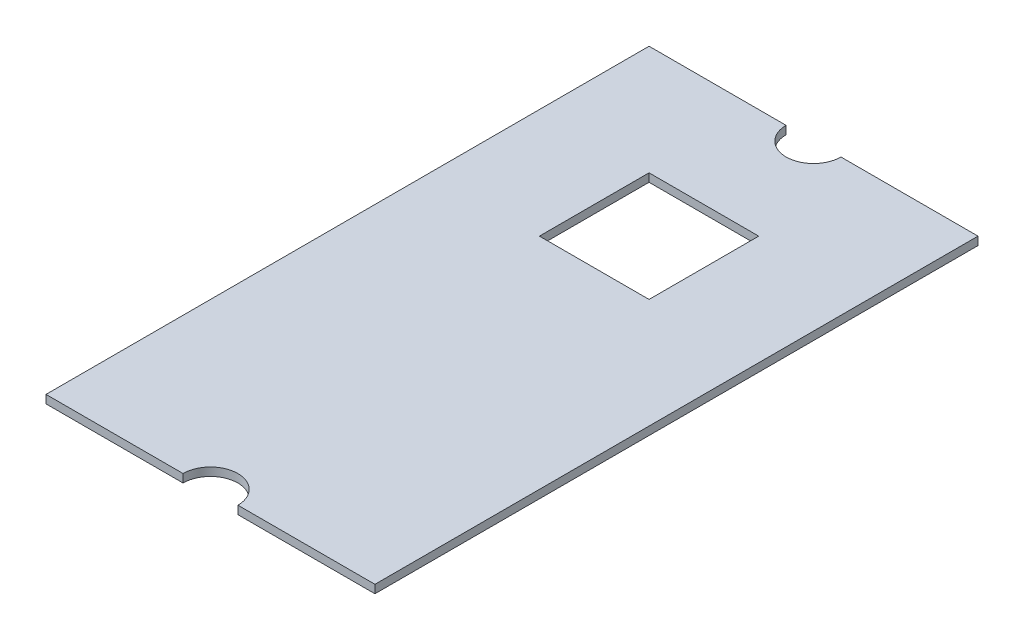
ISO-10303-21;
HEADER;
FILE_DESCRIPTION(('STEP AP214'),'2;1');
FILE_NAME('part.step','',(''),(''),'','','');
FILE_SCHEMA(('AUTOMOTIVE_DESIGN { 1 0 10303 214 1 1 1 1 }'));
ENDSEC;
DATA;
#1=APPLICATION_CONTEXT('core data for automotive mechanical design processes');
#2=APPLICATION_PROTOCOL_DEFINITION('international standard','automotive_design',2000,#1);
#3=PRODUCT_CONTEXT('',#1,'mechanical');
#4=PRODUCT('Part','Part','',(#3));
#5=PRODUCT_RELATED_PRODUCT_CATEGORY('part','',(#4));
#6=PRODUCT_DEFINITION_FORMATION('','',#4);
#7=PRODUCT_DEFINITION_CONTEXT('part definition',#1,'design');
#8=PRODUCT_DEFINITION('design','',#6,#7);
#9=PRODUCT_DEFINITION_SHAPE('','',#8);
#10=(LENGTH_UNIT() NAMED_UNIT(*) SI_UNIT(.MILLI.,.METRE.));
#11=(NAMED_UNIT(*) PLANE_ANGLE_UNIT() SI_UNIT($,.RADIAN.));
#12=(NAMED_UNIT(*) SI_UNIT($,.STERADIAN.) SOLID_ANGLE_UNIT());
#13=UNCERTAINTY_MEASURE_WITH_UNIT(LENGTH_MEASURE(1.E-05),#10,'distance_accuracy_value','');
#14=(GEOMETRIC_REPRESENTATION_CONTEXT(3) GLOBAL_UNCERTAINTY_ASSIGNED_CONTEXT((#13)) GLOBAL_UNIT_ASSIGNED_CONTEXT((#10,
#11,#12)) REPRESENTATION_CONTEXT('',''));
#15=CARTESIAN_POINT('',(0.,0.,0.));
#16=DIRECTION('',(0.,0.,1.));
#17=DIRECTION('',(1.,0.,0.));
#18=AXIS2_PLACEMENT_3D('',#15,#16,#17);
#19=CARTESIAN_POINT('',(0.,0.,220.));
#20=DIRECTION('',(0.,0.,-1.));
#21=DIRECTION('',(-1.,0.,0.));
#22=AXIS2_PLACEMENT_3D('',#19,#20,#21);
#23=PLANE('',#22);
#24=DIRECTION('',(1.,0.,0.));
#25=VECTOR('',#24,1.);
#26=CARTESIAN_POINT('',(0.,0.,220.));
#27=LINE('',#26,#25);
#28=CARTESIAN_POINT('',(0.,0.,220.));
#29=VERTEX_POINT('',#28);
#30=CARTESIAN_POINT('',(50.,0.,220.));
#31=VERTEX_POINT('',#30);
#32=EDGE_CURVE('E182',#29,#31,#27,.T.);
#33=ORIENTED_EDGE('',*,*,#32,.T.);
#34=DIRECTION('',(0.,1.,0.));
#35=VECTOR('',#34,1.);
#36=CARTESIAN_POINT('',(50.,-7.,220.));
#37=LINE('',#36,#35);
#38=CARTESIAN_POINT('',(50.,3.,220.));
#39=VERTEX_POINT('',#38);
#40=EDGE_CURVE('E11',#31,#39,#37,.T.);
#41=ORIENTED_EDGE('',*,*,#40,.T.);
#42=DIRECTION('',(-1.,0.,0.));
#43=VECTOR('',#42,1.);
#44=CARTESIAN_POINT('',(0.,3.,220.));
#45=LINE('',#44,#43);
#46=CARTESIAN_POINT('',(0.,3.,220.));
#47=VERTEX_POINT('',#46);
#48=EDGE_CURVE('E187',#39,#47,#45,.T.);
#49=ORIENTED_EDGE('',*,*,#48,.T.);
#50=DIRECTION('',(0.,-1.,0.));
#51=VECTOR('',#50,1.);
#52=CARTESIAN_POINT('',(0.,0.,220.));
#53=LINE('',#52,#51);
#54=EDGE_CURVE('E177',#47,#29,#53,.T.);
#55=ORIENTED_EDGE('',*,*,#54,.T.);
#56=EDGE_LOOP('',(#33,#41,#49,#55));
#57=FACE_BOUND('',#56,.T.);
#58=ADVANCED_FACE('F40',(#57),#23,.F.);
#59=CARTESIAN_POINT('',(0.,0.,0.));
#60=DIRECTION('',(0.,0.,-1.));
#61=DIRECTION('',(-1.,0.,0.));
#62=AXIS2_PLACEMENT_3D('',#59,#60,#61);
#63=PLANE('',#62);
#64=DIRECTION('',(0.,1.,0.));
#65=VECTOR('',#64,1.);
#66=CARTESIAN_POINT('',(50.,-7.,0.));
#67=LINE('',#66,#65);
#68=CARTESIAN_POINT('',(50.,0.,0.));
#69=VERTEX_POINT('',#68);
#70=CARTESIAN_POINT('',(50.,3.,0.));
#71=VERTEX_POINT('',#70);
#72=EDGE_CURVE('E216',#69,#71,#67,.T.);
#73=ORIENTED_EDGE('',*,*,#72,.F.);
#74=DIRECTION('',(1.,0.,0.));
#75=VECTOR('',#74,1.);
#76=CARTESIAN_POINT('',(0.,0.,0.));
#77=LINE('',#76,#75);
#78=CARTESIAN_POINT('',(0.,0.,0.));
#79=VERTEX_POINT('',#78);
#80=EDGE_CURVE('E195',#79,#69,#77,.T.);
#81=ORIENTED_EDGE('',*,*,#80,.F.);
#82=DIRECTION('',(0.,-1.,0.));
#83=VECTOR('',#82,1.);
#84=CARTESIAN_POINT('',(0.,0.,0.));
#85=LINE('',#84,#83);
#86=CARTESIAN_POINT('',(0.,3.,0.));
#87=VERTEX_POINT('',#86);
#88=EDGE_CURVE('E176',#87,#79,#85,.T.);
#89=ORIENTED_EDGE('',*,*,#88,.F.);
#90=DIRECTION('',(-1.,0.,0.));
#91=VECTOR('',#90,1.);
#92=CARTESIAN_POINT('',(0.,3.,0.));
#93=LINE('',#92,#91);
#94=EDGE_CURVE('E200',#71,#87,#93,.T.);
#95=ORIENTED_EDGE('',*,*,#94,.F.);
#96=EDGE_LOOP('',(#73,#81,#89,#95));
#97=FACE_BOUND('',#96,.T.);
#98=ADVANCED_FACE('F245',(#97),#63,.T.);
#99=CARTESIAN_POINT('',(0.,0.,220.));
#100=DIRECTION('',(1.,0.,0.));
#101=DIRECTION('',(0.,0.,-1.));
#102=AXIS2_PLACEMENT_3D('',#99,#100,#101);
#103=PLANE('',#102);
#104=ORIENTED_EDGE('',*,*,#88,.T.);
#105=DIRECTION('',(0.,0.,-1.));
#106=VECTOR('',#105,1.);
#107=CARTESIAN_POINT('',(0.,0.,220.));
#108=LINE('',#107,#106);
#109=EDGE_CURVE('E211',#29,#79,#108,.T.);
#110=ORIENTED_EDGE('',*,*,#109,.F.);
#111=ORIENTED_EDGE('',*,*,#54,.F.);
#112=DIRECTION('',(0.,0.,-1.));
#113=VECTOR('',#112,1.);
#114=CARTESIAN_POINT('',(0.,3.,220.));
#115=LINE('',#114,#113);
#116=EDGE_CURVE('E191',#47,#87,#115,.T.);
#117=ORIENTED_EDGE('',*,*,#116,.T.);
#118=EDGE_LOOP('',(#104,#110,#111,#117));
#119=FACE_BOUND('',#118,.T.);
#120=ADVANCED_FACE('F42',(#119),#103,.F.);
#121=CARTESIAN_POINT('',(0.,0.,220.));
#122=DIRECTION('',(0.,1.,0.));
#123=DIRECTION('',(0.,0.,1.));
#124=AXIS2_PLACEMENT_3D('',#121,#122,#123);
#125=PLANE('',#124);
#126=DIRECTION('',(1.,0.,0.));
#127=VECTOR('',#126,1.);
#128=CARTESIAN_POINT('',(0.,0.,80.));
#129=LINE('',#128,#127);
#130=CARTESIAN_POINT('',(40.,0.,80.));
#131=VERTEX_POINT('',#130);
#132=CARTESIAN_POINT('',(80.,0.,80.));
#133=VERTEX_POINT('',#132);
#134=EDGE_CURVE('E160',#131,#133,#129,.T.);
#135=ORIENTED_EDGE('',*,*,#134,.T.);
#136=DIRECTION('',(0.,0.,-1.));
#137=VECTOR('',#136,1.);
#138=CARTESIAN_POINT('',(80.,0.,220.));
#139=LINE('',#138,#137);
#140=CARTESIAN_POINT('',(80.,0.,40.));
#141=VERTEX_POINT('',#140);
#142=EDGE_CURVE('E163',#133,#141,#139,.T.);
#143=ORIENTED_EDGE('',*,*,#142,.T.);
#144=DIRECTION('',(-1.,0.,0.));
#145=VECTOR('',#144,1.);
#146=CARTESIAN_POINT('',(0.,0.,40.));
#147=LINE('',#146,#145);
#148=CARTESIAN_POINT('',(40.,0.,40.));
#149=VERTEX_POINT('',#148);
#150=EDGE_CURVE('E155',#141,#149,#147,.T.);
#151=ORIENTED_EDGE('',*,*,#150,.T.);
#152=DIRECTION('',(0.,0.,1.));
#153=VECTOR('',#152,1.);
#154=CARTESIAN_POINT('',(40.,0.,220.));
#155=LINE('',#154,#153);
#156=EDGE_CURVE('E135',#149,#131,#155,.T.);
#157=ORIENTED_EDGE('',*,*,#156,.T.);
#158=EDGE_LOOP('',(#135,#143,#151,#157));
#159=FACE_BOUND('',#158,.T.);
#160=CARTESIAN_POINT('',(70.,0.,220.));
#161=VERTEX_POINT('',#160);
#162=CARTESIAN_POINT('',(120.,0.,220.));
#163=VERTEX_POINT('',#162);
#164=EDGE_CURVE('E180',#161,#163,#27,.T.);
#165=ORIENTED_EDGE('',*,*,#164,.F.);
#166=CARTESIAN_POINT('',(60.,0.,220.));
#167=DIRECTION('',(0.,1.,0.));
#168=DIRECTION('',(0.,0.,1.));
#169=AXIS2_PLACEMENT_3D('',#166,#167,#168);
#170=CIRCLE('',#169,10.);
#171=EDGE_CURVE('E173',#161,#31,#170,.T.);
#172=ORIENTED_EDGE('',*,*,#171,.T.);
#173=ORIENTED_EDGE('',*,*,#32,.F.);
#174=ORIENTED_EDGE('',*,*,#109,.T.);
#175=ORIENTED_EDGE('',*,*,#80,.T.);
#176=CARTESIAN_POINT('',(60.,0.,0.));
#177=DIRECTION('',(0.,1.,0.));
#178=DIRECTION('',(0.,0.,1.));
#179=AXIS2_PLACEMENT_3D('',#176,#177,#178);
#180=CIRCLE('',#179,9.99999999999999);
#181=CARTESIAN_POINT('',(70.,0.,0.));
#182=VERTEX_POINT('',#181);
#183=EDGE_CURVE('E169',#69,#182,#180,.T.);
#184=ORIENTED_EDGE('',*,*,#183,.T.);
#185=CARTESIAN_POINT('',(120.,0.,0.));
#186=VERTEX_POINT('',#185);
#187=EDGE_CURVE('E194',#182,#186,#77,.T.);
#188=ORIENTED_EDGE('',*,*,#187,.T.);
#189=DIRECTION('',(0.,0.,-1.));
#190=VECTOR('',#189,1.);
#191=CARTESIAN_POINT('',(120.,0.,220.));
#192=LINE('',#191,#190);
#193=EDGE_CURVE('E208',#163,#186,#192,.T.);
#194=ORIENTED_EDGE('',*,*,#193,.F.);
#195=EDGE_LOOP('',(#165,#172,#173,#174,#175,#184,#188,#194));
#196=FACE_BOUND('',#195,.T.);
#197=ADVANCED_FACE('F226',(#159,#196),#125,.F.);
#198=CARTESIAN_POINT('',(120.,0.,220.));
#199=DIRECTION('',(-1.,0.,0.));
#200=DIRECTION('',(0.,0.,1.));
#201=AXIS2_PLACEMENT_3D('',#198,#199,#200);
#202=PLANE('',#201);
#203=DIRECTION('',(0.,1.,0.));
#204=VECTOR('',#203,1.);
#205=CARTESIAN_POINT('',(120.,0.,0.));
#206=LINE('',#205,#204);
#207=CARTESIAN_POINT('',(120.,3.,0.));
#208=VERTEX_POINT('',#207);
#209=EDGE_CURVE('E198',#186,#208,#206,.T.);
#210=ORIENTED_EDGE('',*,*,#209,.T.);
#211=DIRECTION('',(0.,0.,-1.));
#212=VECTOR('',#211,1.);
#213=CARTESIAN_POINT('',(120.,3.,220.));
#214=LINE('',#213,#212);
#215=CARTESIAN_POINT('',(120.,3.,220.));
#216=VERTEX_POINT('',#215);
#217=EDGE_CURVE('E205',#216,#208,#214,.T.);
#218=ORIENTED_EDGE('',*,*,#217,.F.);
#219=DIRECTION('',(0.,1.,0.));
#220=VECTOR('',#219,1.);
#221=CARTESIAN_POINT('',(120.,0.,220.));
#222=LINE('',#221,#220);
#223=EDGE_CURVE('E185',#163,#216,#222,.T.);
#224=ORIENTED_EDGE('',*,*,#223,.F.);
#225=ORIENTED_EDGE('',*,*,#193,.T.);
#226=EDGE_LOOP('',(#210,#218,#224,#225));
#227=FACE_BOUND('',#226,.T.);
#228=ADVANCED_FACE('F232',(#227),#202,.F.);
#229=CARTESIAN_POINT('',(0.,3.,220.));
#230=DIRECTION('',(0.,-1.,0.));
#231=DIRECTION('',(0.,0.,-1.));
#232=AXIS2_PLACEMENT_3D('',#229,#230,#231);
#233=PLANE('',#232);
#234=DIRECTION('',(-1.,0.,0.));
#235=VECTOR('',#234,1.);
#236=CARTESIAN_POINT('',(40.,3.,40.));
#237=LINE('',#236,#235);
#238=CARTESIAN_POINT('',(80.,3.,40.));
#239=VERTEX_POINT('',#238);
#240=CARTESIAN_POINT('',(40.,3.,40.));
#241=VERTEX_POINT('',#240);
#242=EDGE_CURVE('E141',#239,#241,#237,.T.);
#243=ORIENTED_EDGE('',*,*,#242,.F.);
#244=DIRECTION('',(0.,0.,-1.));
#245=VECTOR('',#244,1.);
#246=CARTESIAN_POINT('',(80.,3.,40.));
#247=LINE('',#246,#245);
#248=CARTESIAN_POINT('',(80.,3.,80.));
#249=VERTEX_POINT('',#248);
#250=EDGE_CURVE('E63',#249,#239,#247,.T.);
#251=ORIENTED_EDGE('',*,*,#250,.F.);
#252=DIRECTION('',(1.,0.,0.));
#253=VECTOR('',#252,1.);
#254=CARTESIAN_POINT('',(40.,3.,80.));
#255=LINE('',#254,#253);
#256=CARTESIAN_POINT('',(40.,3.,80.));
#257=VERTEX_POINT('',#256);
#258=EDGE_CURVE('E148',#257,#249,#255,.T.);
#259=ORIENTED_EDGE('',*,*,#258,.F.);
#260=DIRECTION('',(0.,0.,1.));
#261=VECTOR('',#260,1.);
#262=CARTESIAN_POINT('',(40.,3.,40.));
#263=LINE('',#262,#261);
#264=EDGE_CURVE('E132',#241,#257,#263,.T.);
#265=ORIENTED_EDGE('',*,*,#264,.F.);
#266=EDGE_LOOP('',(#243,#251,#259,#265));
#267=FACE_BOUND('',#266,.T.);
#268=ORIENTED_EDGE('',*,*,#48,.F.);
#269=CARTESIAN_POINT('',(60.,3.,220.));
#270=DIRECTION('',(0.,1.,0.));
#271=DIRECTION('',(0.,0.,1.));
#272=AXIS2_PLACEMENT_3D('',#269,#270,#271);
#273=CIRCLE('',#272,10.);
#274=CARTESIAN_POINT('',(70.,3.,220.));
#275=VERTEX_POINT('',#274);
#276=EDGE_CURVE('E167',#275,#39,#273,.T.);
#277=ORIENTED_EDGE('',*,*,#276,.F.);
#278=EDGE_CURVE('E188',#216,#275,#45,.T.);
#279=ORIENTED_EDGE('',*,*,#278,.F.);
#280=ORIENTED_EDGE('',*,*,#217,.T.);
#281=CARTESIAN_POINT('',(70.,3.,0.));
#282=VERTEX_POINT('',#281);
#283=EDGE_CURVE('E181',#208,#282,#93,.T.);
#284=ORIENTED_EDGE('',*,*,#283,.T.);
#285=CARTESIAN_POINT('',(60.,3.,0.));
#286=DIRECTION('',(0.,1.,0.));
#287=DIRECTION('',(0.,0.,1.));
#288=AXIS2_PLACEMENT_3D('',#285,#286,#287);
#289=CIRCLE('',#288,9.99999999999999);
#290=EDGE_CURVE('E166',#71,#282,#289,.T.);
#291=ORIENTED_EDGE('',*,*,#290,.F.);
#292=ORIENTED_EDGE('',*,*,#94,.T.);
#293=ORIENTED_EDGE('',*,*,#116,.F.);
#294=EDGE_LOOP('',(#268,#277,#279,#280,#284,#291,#292,#293));
#295=FACE_BOUND('',#294,.T.);
#296=ADVANCED_FACE('F145',(#267,#295),#233,.F.);
#297=ORIENTED_EDGE('',*,*,#278,.T.);
#298=DIRECTION('',(0.,1.,0.));
#299=VECTOR('',#298,1.);
#300=CARTESIAN_POINT('',(70.,-7.,220.));
#301=LINE('',#300,#299);
#302=EDGE_CURVE('E48',#275,#161,#301,.F.);
#303=ORIENTED_EDGE('',*,*,#302,.T.);
#304=ORIENTED_EDGE('',*,*,#164,.T.);
#305=ORIENTED_EDGE('',*,*,#223,.T.);
#306=EDGE_LOOP('',(#297,#303,#304,#305));
#307=FACE_BOUND('',#306,.T.);
#308=ADVANCED_FACE('F220',(#307),#23,.F.);
#309=DIRECTION('',(0.,1.,0.));
#310=VECTOR('',#309,1.);
#311=CARTESIAN_POINT('',(70.,-7.,0.));
#312=LINE('',#311,#310);
#313=EDGE_CURVE('E214',#282,#182,#312,.F.);
#314=ORIENTED_EDGE('',*,*,#313,.F.);
#315=ORIENTED_EDGE('',*,*,#283,.F.);
#316=ORIENTED_EDGE('',*,*,#209,.F.);
#317=ORIENTED_EDGE('',*,*,#187,.F.);
#318=EDGE_LOOP('',(#314,#315,#316,#317));
#319=FACE_BOUND('',#318,.T.);
#320=ADVANCED_FACE('F251',(#319),#63,.T.);
#321=CARTESIAN_POINT('',(60.,-7.,0.));
#322=DIRECTION('',(0.,1.,0.));
#323=DIRECTION('',(0.,0.,1.));
#324=AXIS2_PLACEMENT_3D('',#321,#322,#323);
#325=CYLINDRICAL_SURFACE('',#324,9.99999999999999);
#326=ORIENTED_EDGE('',*,*,#72,.T.);
#327=ORIENTED_EDGE('',*,*,#290,.T.);
#328=ORIENTED_EDGE('',*,*,#313,.T.);
#329=ORIENTED_EDGE('',*,*,#183,.F.);
#330=EDGE_LOOP('',(#326,#327,#328,#329));
#331=FACE_BOUND('',#330,.T.);
#332=ADVANCED_FACE('F248',(#331),#325,.F.);
#333=CARTESIAN_POINT('',(60.,-7.,220.));
#334=DIRECTION('',(0.,1.,0.));
#335=DIRECTION('',(0.,0.,1.));
#336=AXIS2_PLACEMENT_3D('',#333,#334,#335);
#337=CYLINDRICAL_SURFACE('',#336,10.);
#338=ORIENTED_EDGE('',*,*,#171,.F.);
#339=ORIENTED_EDGE('',*,*,#302,.F.);
#340=ORIENTED_EDGE('',*,*,#276,.T.);
#341=ORIENTED_EDGE('',*,*,#40,.F.);
#342=EDGE_LOOP('',(#338,#339,#340,#341));
#343=FACE_BOUND('',#342,.T.);
#344=ADVANCED_FACE('F236',(#343),#337,.F.);
#345=CARTESIAN_POINT('',(80.,-7.,40.));
#346=DIRECTION('',(1.,0.,0.));
#347=DIRECTION('',(0.,0.,-1.));
#348=AXIS2_PLACEMENT_3D('',#345,#346,#347);
#349=PLANE('',#348);
#350=DIRECTION('',(0.,1.,0.));
#351=VECTOR('',#350,1.);
#352=CARTESIAN_POINT('',(80.,-7.,80.));
#353=LINE('',#352,#351);
#354=EDGE_CURVE('E153',#133,#249,#353,.T.);
#355=ORIENTED_EDGE('',*,*,#354,.T.);
#356=ORIENTED_EDGE('',*,*,#250,.T.);
#357=DIRECTION('',(0.,1.,0.));
#358=VECTOR('',#357,1.);
#359=CARTESIAN_POINT('',(80.,-7.,40.));
#360=LINE('',#359,#358);
#361=EDGE_CURVE('E138',#141,#239,#360,.T.);
#362=ORIENTED_EDGE('',*,*,#361,.F.);
#363=ORIENTED_EDGE('',*,*,#142,.F.);
#364=EDGE_LOOP('',(#355,#356,#362,#363));
#365=FACE_BOUND('',#364,.T.);
#366=ADVANCED_FACE('F269',(#365),#349,.F.);
#367=CARTESIAN_POINT('',(40.,-7.,80.));
#368=DIRECTION('',(0.,0.,1.));
#369=DIRECTION('',(1.,0.,0.));
#370=AXIS2_PLACEMENT_3D('',#367,#368,#369);
#371=PLANE('',#370);
#372=DIRECTION('',(0.,1.,0.));
#373=VECTOR('',#372,1.);
#374=CARTESIAN_POINT('',(40.,-7.,80.));
#375=LINE('',#374,#373);
#376=EDGE_CURVE('E137',#131,#257,#375,.T.);
#377=ORIENTED_EDGE('',*,*,#376,.T.);
#378=ORIENTED_EDGE('',*,*,#258,.T.);
#379=ORIENTED_EDGE('',*,*,#354,.F.);
#380=ORIENTED_EDGE('',*,*,#134,.F.);
#381=EDGE_LOOP('',(#377,#378,#379,#380));
#382=FACE_BOUND('',#381,.T.);
#383=ADVANCED_FACE('F272',(#382),#371,.F.);
#384=CARTESIAN_POINT('',(40.,-7.,40.));
#385=DIRECTION('',(-1.,0.,0.));
#386=DIRECTION('',(0.,0.,1.));
#387=AXIS2_PLACEMENT_3D('',#384,#385,#386);
#388=PLANE('',#387);
#389=DIRECTION('',(0.,1.,0.));
#390=VECTOR('',#389,1.);
#391=CARTESIAN_POINT('',(40.,-7.,40.));
#392=LINE('',#391,#390);
#393=EDGE_CURVE('E55',#149,#241,#392,.T.);
#394=ORIENTED_EDGE('',*,*,#393,.T.);
#395=ORIENTED_EDGE('',*,*,#264,.T.);
#396=ORIENTED_EDGE('',*,*,#376,.F.);
#397=ORIENTED_EDGE('',*,*,#156,.F.);
#398=EDGE_LOOP('',(#394,#395,#396,#397));
#399=FACE_BOUND('',#398,.T.);
#400=ADVANCED_FACE('F129',(#399),#388,.F.);
#401=CARTESIAN_POINT('',(40.,-7.,40.));
#402=DIRECTION('',(0.,0.,-1.));
#403=DIRECTION('',(-1.,0.,0.));
#404=AXIS2_PLACEMENT_3D('',#401,#402,#403);
#405=PLANE('',#404);
#406=ORIENTED_EDGE('',*,*,#361,.T.);
#407=ORIENTED_EDGE('',*,*,#242,.T.);
#408=ORIENTED_EDGE('',*,*,#393,.F.);
#409=ORIENTED_EDGE('',*,*,#150,.F.);
#410=EDGE_LOOP('',(#406,#407,#408,#409));
#411=FACE_BOUND('',#410,.T.);
#412=ADVANCED_FACE('F142',(#411),#405,.F.);
#413=CLOSED_SHELL('',(#58,#98,#120,#197,#228,#296,#308,#320,#332,#344,#366,#383,#400,#412));
#414=MANIFOLD_SOLID_BREP('B2',#413);
#415=ADVANCED_BREP_SHAPE_REPRESENTATION('',(#18,#414),#14);
#416=SHAPE_DEFINITION_REPRESENTATION(#9,#415);
ENDSEC;
END-ISO-10303-21;
